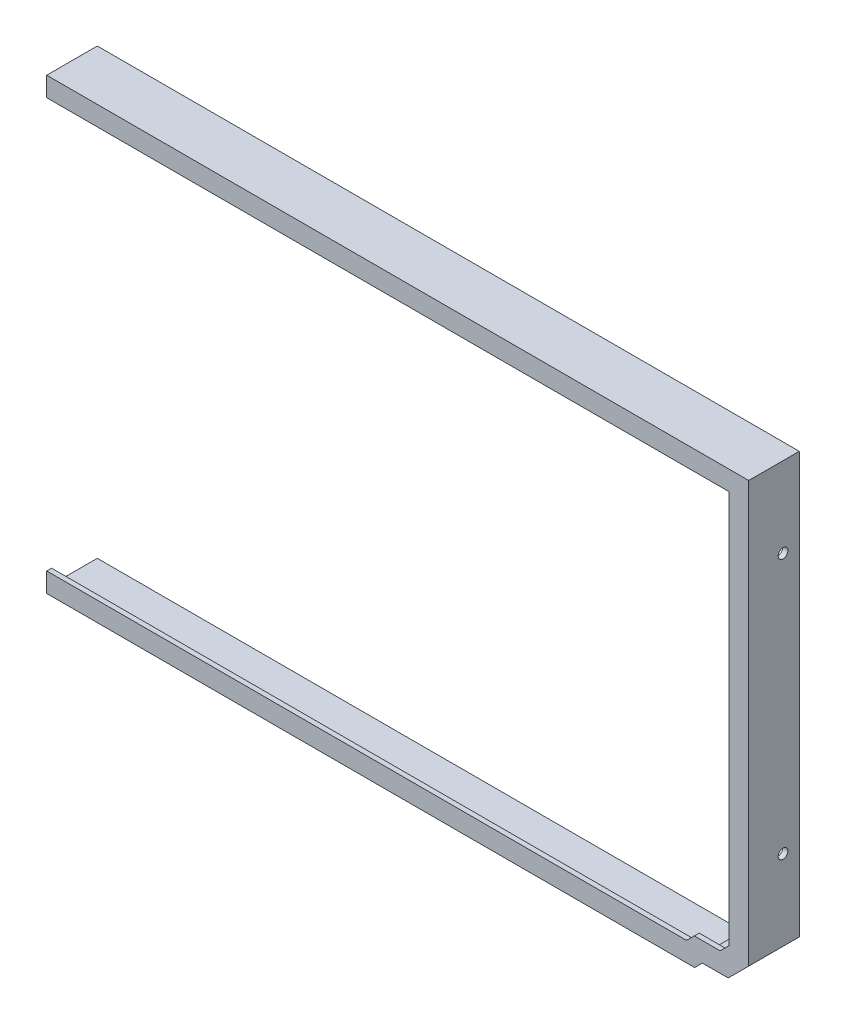
ISO-10303-21;
HEADER;
FILE_DESCRIPTION(('STEP AP214'),'2;1');
FILE_NAME('part.step','',(''),(''),'','','');
FILE_SCHEMA(('AUTOMOTIVE_DESIGN { 1 0 10303 214 1 1 1 1 }'));
ENDSEC;
DATA;
#1=APPLICATION_CONTEXT('core data for automotive mechanical design processes');
#2=APPLICATION_PROTOCOL_DEFINITION('international standard','automotive_design',2000,#1);
#3=PRODUCT_CONTEXT('',#1,'mechanical');
#4=PRODUCT('Part','Part','',(#3));
#5=PRODUCT_RELATED_PRODUCT_CATEGORY('part','',(#4));
#6=PRODUCT_DEFINITION_FORMATION('','',#4);
#7=PRODUCT_DEFINITION_CONTEXT('part definition',#1,'design');
#8=PRODUCT_DEFINITION('design','',#6,#7);
#9=PRODUCT_DEFINITION_SHAPE('','',#8);
#10=(LENGTH_UNIT() NAMED_UNIT(*) SI_UNIT(.MILLI.,.METRE.));
#11=(NAMED_UNIT(*) PLANE_ANGLE_UNIT() SI_UNIT($,.RADIAN.));
#12=(NAMED_UNIT(*) SI_UNIT($,.STERADIAN.) SOLID_ANGLE_UNIT());
#13=UNCERTAINTY_MEASURE_WITH_UNIT(LENGTH_MEASURE(1.E-05),#10,'distance_accuracy_value','');
#14=(GEOMETRIC_REPRESENTATION_CONTEXT(3) GLOBAL_UNCERTAINTY_ASSIGNED_CONTEXT((#13)) GLOBAL_UNIT_ASSIGNED_CONTEXT((#10,
#11,#12)) REPRESENTATION_CONTEXT('',''));
#15=CARTESIAN_POINT('',(0.,0.,0.));
#16=DIRECTION('',(0.,0.,1.));
#17=DIRECTION('',(1.,0.,0.));
#18=AXIS2_PLACEMENT_3D('',#15,#16,#17);
#19=CARTESIAN_POINT('',(-1.7,1.7,-14.05));
#20=DIRECTION('',(0.,1.,0.));
#21=DIRECTION('',(0.,0.,1.));
#22=AXIS2_PLACEMENT_3D('',#19,#20,#21);
#23=PLANE('',#22);
#24=DIRECTION('',(0.,0.,-1.));
#25=VECTOR('',#24,1.);
#26=CARTESIAN_POINT('',(214.14,1.7,1.5));
#27=LINE('',#26,#25);
#28=CARTESIAN_POINT('',(214.14,1.7,1.5));
#29=VERTEX_POINT('',#28);
#30=CARTESIAN_POINT('',(214.14,1.7,-14.05));
#31=VERTEX_POINT('',#30);
#32=EDGE_CURVE('E197',#29,#31,#27,.T.);
#33=ORIENTED_EDGE('',*,*,#32,.F.);
#34=DIRECTION('',(-1.,0.,0.));
#35=VECTOR('',#34,1.);
#36=CARTESIAN_POINT('',(429.98,1.7,1.5));
#37=LINE('',#36,#35);
#38=CARTESIAN_POINT('',(429.98,1.7,1.5));
#39=VERTEX_POINT('',#38);
#40=EDGE_CURVE('E277',#39,#29,#37,.T.);
#41=ORIENTED_EDGE('',*,*,#40,.F.);
#42=DIRECTION('',(0.,0.,1.));
#43=VECTOR('',#42,1.);
#44=CARTESIAN_POINT('',(429.98,1.7,-14.05));
#45=LINE('',#44,#43);
#46=CARTESIAN_POINT('',(429.98,1.7,-14.05));
#47=VERTEX_POINT('',#46);
#48=EDGE_CURVE('E47',#47,#39,#45,.T.);
#49=ORIENTED_EDGE('',*,*,#48,.F.);
#50=DIRECTION('',(-1.,0.,0.));
#51=VECTOR('',#50,1.);
#52=CARTESIAN_POINT('',(-1.7,1.7,-14.05));
#53=LINE('',#52,#51);
#54=EDGE_CURVE('E223',#47,#31,#53,.T.);
#55=ORIENTED_EDGE('',*,*,#54,.T.);
#56=EDGE_LOOP('',(#33,#41,#49,#55));
#57=FACE_BOUND('',#56,.T.);
#58=ADVANCED_FACE('F39',(#57),#23,.T.);
#59=CARTESIAN_POINT('',(429.98,1.7,-14.05));
#60=DIRECTION('',(1.,0.,0.));
#61=DIRECTION('',(0.,0.,-1.));
#62=AXIS2_PLACEMENT_3D('',#59,#60,#61);
#63=PLANE('',#62);
#64=CARTESIAN_POINT('',(429.98,-22.9620815280171,-9.05000000000001));
#65=DIRECTION('',(1.,0.,0.));
#66=DIRECTION('',(0.,0.,-1.));
#67=AXIS2_PLACEMENT_3D('',#64,#65,#66);
#68=CIRCLE('',#67,1.5);
#69=CARTESIAN_POINT('',(429.98,-22.9620815280171,-10.55));
#70=VERTEX_POINT('',#69);
#71=EDGE_CURVE('E238',#70,#70,#68,.F.);
#72=ORIENTED_EDGE('',*,*,#71,.T.);
#73=EDGE_LOOP('',(#72));
#74=FACE_BOUND('',#73,.T.);
#75=CARTESIAN_POINT('',(429.98,-102.962081528017,-9.05000000000001));
#76=DIRECTION('',(1.,0.,0.));
#77=DIRECTION('',(0.,0.,-1.));
#78=AXIS2_PLACEMENT_3D('',#75,#76,#77);
#79=CIRCLE('',#78,1.5);
#80=CARTESIAN_POINT('',(429.98,-102.962081528017,-10.55));
#81=VERTEX_POINT('',#80);
#82=EDGE_CURVE('E359',#81,#81,#79,.F.);
#83=ORIENTED_EDGE('',*,*,#82,.T.);
#84=EDGE_LOOP('',(#83));
#85=FACE_BOUND('',#84,.T.);
#86=ORIENTED_EDGE('',*,*,#48,.T.);
#87=DIRECTION('',(0.,1.,0.));
#88=VECTOR('',#87,1.);
#89=CARTESIAN_POINT('',(429.98,-127.624163056034,1.5));
#90=LINE('',#89,#88);
#91=CARTESIAN_POINT('',(429.98,-127.624163056034,1.5));
#92=VERTEX_POINT('',#91);
#93=EDGE_CURVE('E290',#92,#39,#90,.T.);
#94=ORIENTED_EDGE('',*,*,#93,.F.);
#95=DIRECTION('',(0.,0.,1.));
#96=VECTOR('',#95,1.);
#97=CARTESIAN_POINT('',(429.98,-127.624163056034,-14.05));
#98=LINE('',#97,#96);
#99=CARTESIAN_POINT('',(429.98,-127.624163056034,-14.05));
#100=VERTEX_POINT('',#99);
#101=EDGE_CURVE('E228',#100,#92,#98,.T.);
#102=ORIENTED_EDGE('',*,*,#101,.F.);
#103=DIRECTION('',(0.,1.,0.));
#104=VECTOR('',#103,1.);
#105=CARTESIAN_POINT('',(429.98,1.7,-14.05));
#106=LINE('',#105,#104);
#107=EDGE_CURVE('E220',#100,#47,#106,.T.);
#108=ORIENTED_EDGE('',*,*,#107,.T.);
#109=EDGE_LOOP('',(#86,#94,#102,#108));
#110=FACE_BOUND('',#109,.T.);
#111=ADVANCED_FACE('F407',(#74,#85,#110),#63,.T.);
#112=CARTESIAN_POINT('',(429.98,-127.624163056034,-14.05));
#113=DIRECTION('',(0.707106781186549,-0.707106781186546,0.));
#114=DIRECTION('',(0.707106781186546,0.707106781186549,0.));
#115=AXIS2_PLACEMENT_3D('',#112,#113,#114);
#116=PLANE('',#115);
#117=ORIENTED_EDGE('',*,*,#101,.T.);
#118=DIRECTION('',(0.707106781186546,0.707106781186549,0.));
#119=VECTOR('',#118,1.);
#120=CARTESIAN_POINT('',(423.673791129323,-133.930371926711,1.5));
#121=LINE('',#120,#119);
#122=CARTESIAN_POINT('',(423.673791129323,-133.930371926711,1.5));
#123=VERTEX_POINT('',#122);
#124=EDGE_CURVE('E287',#123,#92,#121,.T.);
#125=ORIENTED_EDGE('',*,*,#124,.F.);
#126=DIRECTION('',(0.,0.,1.));
#127=VECTOR('',#126,1.);
#128=CARTESIAN_POINT('',(423.673791129323,-133.930371926711,-14.05));
#129=LINE('',#128,#127);
#130=CARTESIAN_POINT('',(423.673791129323,-133.930371926711,-14.05));
#131=VERTEX_POINT('',#130);
#132=EDGE_CURVE('E230',#131,#123,#129,.T.);
#133=ORIENTED_EDGE('',*,*,#132,.F.);
#134=DIRECTION('',(0.707106781186546,0.707106781186549,0.));
#135=VECTOR('',#134,1.);
#136=CARTESIAN_POINT('',(429.98,-127.624163056034,-14.05));
#137=LINE('',#136,#135);
#138=EDGE_CURVE('E217',#131,#100,#137,.T.);
#139=ORIENTED_EDGE('',*,*,#138,.T.);
#140=EDGE_LOOP('',(#117,#125,#133,#139));
#141=FACE_BOUND('',#140,.T.);
#142=ADVANCED_FACE('F415',(#141),#116,.T.);
#143=CARTESIAN_POINT('',(423.673791129323,-133.930371926711,-14.05));
#144=DIRECTION('',(0.,-1.,0.));
#145=DIRECTION('',(0.,0.,-1.));
#146=AXIS2_PLACEMENT_3D('',#143,#144,#145);
#147=PLANE('',#146);
#148=ORIENTED_EDGE('',*,*,#132,.T.);
#149=DIRECTION('',(1.,0.,0.));
#150=VECTOR('',#149,1.);
#151=CARTESIAN_POINT('',(415.733791129323,-133.930371926711,1.5));
#152=LINE('',#151,#150);
#153=CARTESIAN_POINT('',(415.733791129323,-133.930371926711,1.5));
#154=VERTEX_POINT('',#153);
#155=EDGE_CURVE('E284',#154,#123,#152,.T.);
#156=ORIENTED_EDGE('',*,*,#155,.F.);
#157=DIRECTION('',(0.,0.,1.));
#158=VECTOR('',#157,1.);
#159=CARTESIAN_POINT('',(415.733791129323,-133.930371926711,-14.05));
#160=LINE('',#159,#158);
#161=CARTESIAN_POINT('',(415.733791129323,-133.930371926711,-14.05));
#162=VERTEX_POINT('',#161);
#163=EDGE_CURVE('E232',#162,#154,#160,.T.);
#164=ORIENTED_EDGE('',*,*,#163,.F.);
#165=DIRECTION('',(1.,0.,0.));
#166=VECTOR('',#165,1.);
#167=CARTESIAN_POINT('',(423.673791129323,-133.930371926711,-14.05));
#168=LINE('',#167,#166);
#169=EDGE_CURVE('E206',#162,#131,#168,.T.);
#170=ORIENTED_EDGE('',*,*,#169,.T.);
#171=EDGE_LOOP('',(#148,#156,#164,#170));
#172=FACE_BOUND('',#171,.T.);
#173=ADVANCED_FACE('F423',(#172),#147,.T.);
#174=CARTESIAN_POINT('',(415.733791129323,-133.930371926711,-14.05));
#175=DIRECTION('',(0.707106781186543,-0.707106781186552,0.));
#176=DIRECTION('',(0.707106781186552,0.707106781186543,0.));
#177=AXIS2_PLACEMENT_3D('',#174,#175,#176);
#178=PLANE('',#177);
#179=ORIENTED_EDGE('',*,*,#163,.T.);
#180=DIRECTION('',(0.707106781186552,0.707106781186543,0.));
#181=VECTOR('',#180,1.);
#182=CARTESIAN_POINT('',(413.350841276725,-136.31332177931,1.5));
#183=LINE('',#182,#181);
#184=CARTESIAN_POINT('',(413.350841276725,-136.31332177931,1.5));
#185=VERTEX_POINT('',#184);
#186=EDGE_CURVE('E281',#185,#154,#183,.T.);
#187=ORIENTED_EDGE('',*,*,#186,.F.);
#188=DIRECTION('',(0.,0.,1.));
#189=VECTOR('',#188,1.);
#190=CARTESIAN_POINT('',(413.350841276725,-136.31332177931,-14.05));
#191=LINE('',#190,#189);
#192=CARTESIAN_POINT('',(413.350841276725,-136.31332177931,-14.05));
#193=VERTEX_POINT('',#192);
#194=EDGE_CURVE('E226',#193,#185,#191,.T.);
#195=ORIENTED_EDGE('',*,*,#194,.F.);
#196=DIRECTION('',(0.707106781186552,0.707106781186543,0.));
#197=VECTOR('',#196,1.);
#198=CARTESIAN_POINT('',(415.733791129323,-133.930371926711,-14.05));
#199=LINE('',#198,#197);
#200=EDGE_CURVE('E203',#193,#162,#199,.T.);
#201=ORIENTED_EDGE('',*,*,#200,.T.);
#202=EDGE_LOOP('',(#179,#187,#195,#201));
#203=FACE_BOUND('',#202,.T.);
#204=ADVANCED_FACE('F426',(#203),#178,.T.);
#205=CARTESIAN_POINT('',(413.350841276725,-136.31332177931,-14.05));
#206=DIRECTION('',(0.,-1.,0.));
#207=DIRECTION('',(0.,0.,-1.));
#208=AXIS2_PLACEMENT_3D('',#205,#206,#207);
#209=PLANE('',#208);
#210=DIRECTION('',(0.,0.,-1.));
#211=VECTOR('',#210,1.);
#212=CARTESIAN_POINT('',(214.14,-136.31332177931,1.5));
#213=LINE('',#212,#211);
#214=CARTESIAN_POINT('',(214.14,-136.31332177931,1.5));
#215=VERTEX_POINT('',#214);
#216=CARTESIAN_POINT('',(214.14,-136.31332177931,-14.05));
#217=VERTEX_POINT('',#216);
#218=EDGE_CURVE('E182',#215,#217,#213,.T.);
#219=ORIENTED_EDGE('',*,*,#218,.T.);
#220=DIRECTION('',(1.,0.,0.));
#221=VECTOR('',#220,1.);
#222=CARTESIAN_POINT('',(413.350841276725,-136.31332177931,-14.05));
#223=LINE('',#222,#221);
#224=EDGE_CURVE('E194',#217,#193,#223,.T.);
#225=ORIENTED_EDGE('',*,*,#224,.T.);
#226=ORIENTED_EDGE('',*,*,#194,.T.);
#227=DIRECTION('',(1.,0.,0.));
#228=VECTOR('',#227,1.);
#229=CARTESIAN_POINT('',(14.9291587232754,-136.31332177931,1.5));
#230=LINE('',#229,#228);
#231=EDGE_CURVE('E196',#215,#185,#230,.T.);
#232=ORIENTED_EDGE('',*,*,#231,.F.);
#233=EDGE_LOOP('',(#219,#225,#226,#232));
#234=FACE_BOUND('',#233,.T.);
#235=ADVANCED_FACE('F41',(#234),#209,.T.);
#236=CARTESIAN_POINT('',(0.,0.,-14.05));
#237=DIRECTION('',(0.,0.,1.));
#238=DIRECTION('',(1.,0.,0.));
#239=AXIS2_PLACEMENT_3D('',#236,#237,#238);
#240=PLANE('',#239);
#241=ORIENTED_EDGE('',*,*,#224,.F.);
#242=DIRECTION('',(0.,1.,0.));
#243=VECTOR('',#242,1.);
#244=CARTESIAN_POINT('',(214.14,-136.31332177931,-14.05));
#245=LINE('',#244,#243);
#246=CARTESIAN_POINT('',(214.14,-134.71332177931,-14.05));
#247=VERTEX_POINT('',#246);
#248=EDGE_CURVE('E179',#217,#247,#245,.T.);
#249=ORIENTED_EDGE('',*,*,#248,.T.);
#250=DIRECTION('',(1.,0.,0.));
#251=VECTOR('',#250,1.);
#252=CARTESIAN_POINT('',(412.688099576928,-134.71332177931,-14.05));
#253=LINE('',#252,#251);
#254=CARTESIAN_POINT('',(412.688099576928,-134.71332177931,-14.05));
#255=VERTEX_POINT('',#254);
#256=EDGE_CURVE('E294',#247,#255,#253,.T.);
#257=ORIENTED_EDGE('',*,*,#256,.T.);
#258=DIRECTION('',(0.707106781186552,0.707106781186543,0.));
#259=VECTOR('',#258,1.);
#260=CARTESIAN_POINT('',(415.071049429526,-132.330371926711,-14.05));
#261=LINE('',#260,#259);
#262=CARTESIAN_POINT('',(415.071049429526,-132.330371926711,-14.05));
#263=VERTEX_POINT('',#262);
#264=EDGE_CURVE('E296',#255,#263,#261,.T.);
#265=ORIENTED_EDGE('',*,*,#264,.T.);
#266=DIRECTION('',(1.,0.,0.));
#267=VECTOR('',#266,1.);
#268=CARTESIAN_POINT('',(423.011049429526,-132.330371926711,-14.05));
#269=LINE('',#268,#267);
#270=CARTESIAN_POINT('',(423.011049429526,-132.330371926711,-14.05));
#271=VERTEX_POINT('',#270);
#272=EDGE_CURVE('E300',#263,#271,#269,.T.);
#273=ORIENTED_EDGE('',*,*,#272,.T.);
#274=DIRECTION('',(0.707106781186547,0.707106781186547,0.));
#275=VECTOR('',#274,1.);
#276=CARTESIAN_POINT('',(428.38,-126.961421356237,-14.05));
#277=LINE('',#276,#275);
#278=CARTESIAN_POINT('',(428.38,-126.961421356237,-14.05));
#279=VERTEX_POINT('',#278);
#280=EDGE_CURVE('E303',#271,#279,#277,.T.);
#281=ORIENTED_EDGE('',*,*,#280,.T.);
#282=DIRECTION('',(0.,1.,0.));
#283=VECTOR('',#282,1.);
#284=CARTESIAN_POINT('',(428.38,0.1,-14.05));
#285=LINE('',#284,#283);
#286=CARTESIAN_POINT('',(428.38,0.1,-14.05));
#287=VERTEX_POINT('',#286);
#288=EDGE_CURVE('E306',#279,#287,#285,.T.);
#289=ORIENTED_EDGE('',*,*,#288,.T.);
#290=DIRECTION('',(-1.,0.,0.));
#291=VECTOR('',#290,1.);
#292=CARTESIAN_POINT('',(-0.1,0.1,-14.05));
#293=LINE('',#292,#291);
#294=CARTESIAN_POINT('',(214.14,0.099999999999989,-14.05));
#295=VERTEX_POINT('',#294);
#296=EDGE_CURVE('E309',#287,#295,#293,.T.);
#297=ORIENTED_EDGE('',*,*,#296,.T.);
#298=EDGE_CURVE('E189',#295,#31,#245,.T.);
#299=ORIENTED_EDGE('',*,*,#298,.T.);
#300=ORIENTED_EDGE('',*,*,#54,.F.);
#301=ORIENTED_EDGE('',*,*,#107,.F.);
#302=ORIENTED_EDGE('',*,*,#138,.F.);
#303=ORIENTED_EDGE('',*,*,#169,.F.);
#304=ORIENTED_EDGE('',*,*,#200,.F.);
#305=EDGE_LOOP('',(#241,#249,#257,#265,#273,#281,#289,#297,#299,#300,#301,#302,#303,#304));
#306=FACE_BOUND('',#305,.T.);
#307=ADVANCED_FACE('F200',(#306),#240,.F.);
#308=CARTESIAN_POINT('',(-0.1,0.1,-14.05));
#309=DIRECTION('',(0.,1.,0.));
#310=DIRECTION('',(0.,0.,1.));
#311=AXIS2_PLACEMENT_3D('',#308,#309,#310);
#312=PLANE('',#311);
#313=DIRECTION('',(-1.,0.,0.));
#314=VECTOR('',#313,1.);
#315=CARTESIAN_POINT('',(-0.1,0.1,0.));
#316=LINE('',#315,#314);
#317=CARTESIAN_POINT('',(428.38,0.1,0.));
#318=VERTEX_POINT('',#317);
#319=CARTESIAN_POINT('',(214.14,0.1,0.));
#320=VERTEX_POINT('',#319);
#321=EDGE_CURVE('E297',#318,#320,#316,.T.);
#322=ORIENTED_EDGE('',*,*,#321,.T.);
#323=DIRECTION('',(0.,0.,-1.));
#324=VECTOR('',#323,1.);
#325=CARTESIAN_POINT('',(214.14,0.1,-14.05));
#326=LINE('',#325,#324);
#327=EDGE_CURVE('E358',#320,#295,#326,.T.);
#328=ORIENTED_EDGE('',*,*,#327,.T.);
#329=ORIENTED_EDGE('',*,*,#296,.F.);
#330=DIRECTION('',(0.,0.,1.));
#331=VECTOR('',#330,1.);
#332=CARTESIAN_POINT('',(428.38,0.1,-14.05));
#333=LINE('',#332,#331);
#334=EDGE_CURVE('E204',#287,#318,#333,.T.);
#335=ORIENTED_EDGE('',*,*,#334,.T.);
#336=EDGE_LOOP('',(#322,#328,#329,#335));
#337=FACE_BOUND('',#336,.T.);
#338=ADVANCED_FACE('F357',(#337),#312,.F.);
#339=CARTESIAN_POINT('',(428.38,0.1,-14.05));
#340=DIRECTION('',(1.,0.,0.));
#341=DIRECTION('',(0.,0.,-1.));
#342=AXIS2_PLACEMENT_3D('',#339,#340,#341);
#343=PLANE('',#342);
#344=CARTESIAN_POINT('',(428.38,-22.9620815280171,-9.05000000000001));
#345=DIRECTION('',(1.,0.,0.));
#346=DIRECTION('',(0.,0.,-1.));
#347=AXIS2_PLACEMENT_3D('',#344,#345,#346);
#348=CIRCLE('',#347,1.5);
#349=CARTESIAN_POINT('',(428.38,-22.9620815280171,-10.55));
#350=VERTEX_POINT('',#349);
#351=EDGE_CURVE('E237',#350,#350,#348,.T.);
#352=ORIENTED_EDGE('',*,*,#351,.T.);
#353=EDGE_LOOP('',(#352));
#354=FACE_BOUND('',#353,.T.);
#355=CARTESIAN_POINT('',(428.38,-102.962081528017,-9.05000000000001));
#356=DIRECTION('',(1.,0.,0.));
#357=DIRECTION('',(0.,0.,-1.));
#358=AXIS2_PLACEMENT_3D('',#355,#356,#357);
#359=CIRCLE('',#358,1.5);
#360=CARTESIAN_POINT('',(428.38,-102.962081528017,-10.55));
#361=VERTEX_POINT('',#360);
#362=EDGE_CURVE('E235',#361,#361,#359,.T.);
#363=ORIENTED_EDGE('',*,*,#362,.T.);
#364=EDGE_LOOP('',(#363));
#365=FACE_BOUND('',#364,.T.);
#366=DIRECTION('',(0.,1.,0.));
#367=VECTOR('',#366,1.);
#368=CARTESIAN_POINT('',(428.38,0.1,0.));
#369=LINE('',#368,#367);
#370=CARTESIAN_POINT('',(428.38,-126.961421356237,0.));
#371=VERTEX_POINT('',#370);
#372=EDGE_CURVE('E322',#371,#318,#369,.T.);
#373=ORIENTED_EDGE('',*,*,#372,.T.);
#374=ORIENTED_EDGE('',*,*,#334,.F.);
#375=ORIENTED_EDGE('',*,*,#288,.F.);
#376=DIRECTION('',(0.,0.,1.));
#377=VECTOR('',#376,1.);
#378=CARTESIAN_POINT('',(428.38,-126.961421356237,-14.05));
#379=LINE('',#378,#377);
#380=EDGE_CURVE('E209',#279,#371,#379,.T.);
#381=ORIENTED_EDGE('',*,*,#380,.T.);
#382=EDGE_LOOP('',(#373,#374,#375,#381));
#383=FACE_BOUND('',#382,.T.);
#384=ADVANCED_FACE('F354',(#354,#365,#383),#343,.F.);
#385=CARTESIAN_POINT('',(428.38,-126.961421356237,-14.05));
#386=DIRECTION('',(0.707106781186547,-0.707106781186547,0.));
#387=DIRECTION('',(0.707106781186548,0.707106781186548,0.));
#388=AXIS2_PLACEMENT_3D('',#385,#386,#387);
#389=PLANE('',#388);
#390=DIRECTION('',(0.707106781186547,0.707106781186547,0.));
#391=VECTOR('',#390,1.);
#392=CARTESIAN_POINT('',(428.38,-126.961421356237,0.));
#393=LINE('',#392,#391);
#394=CARTESIAN_POINT('',(423.011049429526,-132.330371926711,0.));
#395=VERTEX_POINT('',#394);
#396=EDGE_CURVE('E319',#395,#371,#393,.T.);
#397=ORIENTED_EDGE('',*,*,#396,.T.);
#398=ORIENTED_EDGE('',*,*,#380,.F.);
#399=ORIENTED_EDGE('',*,*,#280,.F.);
#400=DIRECTION('',(0.,0.,1.));
#401=VECTOR('',#400,1.);
#402=CARTESIAN_POINT('',(423.011049429526,-132.330371926711,-14.05));
#403=LINE('',#402,#401);
#404=EDGE_CURVE('E329',#271,#395,#403,.T.);
#405=ORIENTED_EDGE('',*,*,#404,.T.);
#406=EDGE_LOOP('',(#397,#398,#399,#405));
#407=FACE_BOUND('',#406,.T.);
#408=ADVANCED_FACE('F349',(#407),#389,.F.);
#409=CARTESIAN_POINT('',(423.011049429526,-132.330371926711,-14.05));
#410=DIRECTION('',(0.,-1.,0.));
#411=DIRECTION('',(0.,0.,-1.));
#412=AXIS2_PLACEMENT_3D('',#409,#410,#411);
#413=PLANE('',#412);
#414=DIRECTION('',(1.,0.,0.));
#415=VECTOR('',#414,1.);
#416=CARTESIAN_POINT('',(423.011049429526,-132.330371926711,0.));
#417=LINE('',#416,#415);
#418=CARTESIAN_POINT('',(415.071049429526,-132.330371926711,0.));
#419=VERTEX_POINT('',#418);
#420=EDGE_CURVE('E316',#419,#395,#417,.T.);
#421=ORIENTED_EDGE('',*,*,#420,.T.);
#422=ORIENTED_EDGE('',*,*,#404,.F.);
#423=ORIENTED_EDGE('',*,*,#272,.F.);
#424=DIRECTION('',(0.,0.,1.));
#425=VECTOR('',#424,1.);
#426=CARTESIAN_POINT('',(415.071049429526,-132.330371926711,-14.05));
#427=LINE('',#426,#425);
#428=EDGE_CURVE('E331',#263,#419,#427,.T.);
#429=ORIENTED_EDGE('',*,*,#428,.T.);
#430=EDGE_LOOP('',(#421,#422,#423,#429));
#431=FACE_BOUND('',#430,.T.);
#432=ADVANCED_FACE('F346',(#431),#413,.F.);
#433=CARTESIAN_POINT('',(415.071049429526,-132.330371926711,-14.05));
#434=DIRECTION('',(0.707106781186543,-0.707106781186552,0.));
#435=DIRECTION('',(0.707106781186552,0.707106781186543,0.));
#436=AXIS2_PLACEMENT_3D('',#433,#434,#435);
#437=PLANE('',#436);
#438=DIRECTION('',(0.707106781186552,0.707106781186543,0.));
#439=VECTOR('',#438,1.);
#440=CARTESIAN_POINT('',(415.071049429526,-132.330371926711,0.));
#441=LINE('',#440,#439);
#442=CARTESIAN_POINT('',(412.688099576928,-134.71332177931,0.));
#443=VERTEX_POINT('',#442);
#444=EDGE_CURVE('E313',#443,#419,#441,.T.);
#445=ORIENTED_EDGE('',*,*,#444,.T.);
#446=ORIENTED_EDGE('',*,*,#428,.F.);
#447=ORIENTED_EDGE('',*,*,#264,.F.);
#448=DIRECTION('',(0.,0.,1.));
#449=VECTOR('',#448,1.);
#450=CARTESIAN_POINT('',(412.688099576928,-134.71332177931,-14.05));
#451=LINE('',#450,#449);
#452=EDGE_CURVE('E212',#255,#443,#451,.T.);
#453=ORIENTED_EDGE('',*,*,#452,.T.);
#454=EDGE_LOOP('',(#445,#446,#447,#453));
#455=FACE_BOUND('',#454,.T.);
#456=ADVANCED_FACE('F339',(#455),#437,.F.);
#457=CARTESIAN_POINT('',(412.688099576928,-134.71332177931,-14.05));
#458=DIRECTION('',(0.,-1.,0.));
#459=DIRECTION('',(0.,0.,-1.));
#460=AXIS2_PLACEMENT_3D('',#457,#458,#459);
#461=PLANE('',#460);
#462=ORIENTED_EDGE('',*,*,#256,.F.);
#463=DIRECTION('',(0.,0.,1.));
#464=VECTOR('',#463,1.);
#465=CARTESIAN_POINT('',(214.14,-134.71332177931,-14.05));
#466=LINE('',#465,#464);
#467=CARTESIAN_POINT('',(214.14,-134.71332177931,0.));
#468=VERTEX_POINT('',#467);
#469=EDGE_CURVE('E184',#247,#468,#466,.T.);
#470=ORIENTED_EDGE('',*,*,#469,.T.);
#471=DIRECTION('',(1.,0.,0.));
#472=VECTOR('',#471,1.);
#473=CARTESIAN_POINT('',(412.688099576928,-134.71332177931,0.));
#474=LINE('',#473,#472);
#475=EDGE_CURVE('E293',#468,#443,#474,.T.);
#476=ORIENTED_EDGE('',*,*,#475,.T.);
#477=ORIENTED_EDGE('',*,*,#452,.F.);
#478=EDGE_LOOP('',(#462,#470,#476,#477));
#479=FACE_BOUND('',#478,.T.);
#480=ADVANCED_FACE('F342',(#479),#461,.F.);
#481=CARTESIAN_POINT('',(0.,0.,1.5));
#482=DIRECTION('',(0.,0.,1.));
#483=DIRECTION('',(1.,0.,0.));
#484=AXIS2_PLACEMENT_3D('',#481,#482,#483);
#485=PLANE('',#484);
#486=DIRECTION('',(0.,1.,0.));
#487=VECTOR('',#486,1.);
#488=CARTESIAN_POINT('',(214.14,-136.31332177931,1.5));
#489=LINE('',#488,#487);
#490=CARTESIAN_POINT('',(214.14,-130.31332177931,1.5));
#491=VERTEX_POINT('',#490);
#492=EDGE_CURVE('E61',#215,#491,#489,.T.);
#493=ORIENTED_EDGE('',*,*,#492,.F.);
#494=ORIENTED_EDGE('',*,*,#231,.T.);
#495=ORIENTED_EDGE('',*,*,#186,.T.);
#496=ORIENTED_EDGE('',*,*,#155,.T.);
#497=ORIENTED_EDGE('',*,*,#124,.T.);
#498=ORIENTED_EDGE('',*,*,#93,.T.);
#499=ORIENTED_EDGE('',*,*,#40,.T.);
#500=CARTESIAN_POINT('',(214.14,-4.3,1.5));
#501=VERTEX_POINT('',#500);
#502=EDGE_CURVE('E188',#501,#29,#489,.T.);
#503=ORIENTED_EDGE('',*,*,#502,.F.);
#504=DIRECTION('',(-1.,0.,0.));
#505=VECTOR('',#504,1.);
#506=CARTESIAN_POINT('',(423.98,-4.3,1.5));
#507=LINE('',#506,#505);
#508=CARTESIAN_POINT('',(423.98,-4.3,1.5));
#509=VERTEX_POINT('',#508);
#510=EDGE_CURVE('E264',#509,#501,#507,.T.);
#511=ORIENTED_EDGE('',*,*,#510,.F.);
#512=DIRECTION('',(0.,1.,0.));
#513=VECTOR('',#512,1.);
#514=CARTESIAN_POINT('',(423.98,-125.138881681796,1.5));
#515=LINE('',#514,#513);
#516=CARTESIAN_POINT('',(423.98,-125.138881681796,1.5));
#517=VERTEX_POINT('',#516);
#518=EDGE_CURVE('E251',#517,#509,#515,.T.);
#519=ORIENTED_EDGE('',*,*,#518,.F.);
#520=DIRECTION('',(0.707106781186544,0.707106781186551,0.));
#521=VECTOR('',#520,1.);
#522=CARTESIAN_POINT('',(421.188509755085,-127.930371926711,1.5));
#523=LINE('',#522,#521);
#524=CARTESIAN_POINT('',(421.188509755085,-127.930371926711,1.5));
#525=VERTEX_POINT('',#524);
#526=EDGE_CURVE('E378',#525,#517,#523,.T.);
#527=ORIENTED_EDGE('',*,*,#526,.F.);
#528=DIRECTION('',(1.,0.,0.));
#529=VECTOR('',#528,1.);
#530=CARTESIAN_POINT('',(413.248509755085,-127.930371926711,1.5));
#531=LINE('',#530,#529);
#532=CARTESIAN_POINT('',(413.248509755085,-127.930371926711,1.5));
#533=VERTEX_POINT('',#532);
#534=EDGE_CURVE('E377',#533,#525,#531,.T.);
#535=ORIENTED_EDGE('',*,*,#534,.F.);
#536=DIRECTION('',(0.707106781186552,0.707106781186543,0.));
#537=VECTOR('',#536,1.);
#538=CARTESIAN_POINT('',(410.865559902486,-130.31332177931,1.5));
#539=LINE('',#538,#537);
#540=CARTESIAN_POINT('',(410.865559902486,-130.31332177931,1.5));
#541=VERTEX_POINT('',#540);
#542=EDGE_CURVE('E375',#541,#533,#539,.T.);
#543=ORIENTED_EDGE('',*,*,#542,.F.);
#544=DIRECTION('',(1.,0.,0.));
#545=VECTOR('',#544,1.);
#546=CARTESIAN_POINT('',(17.414440097514,-130.31332177931,1.5));
#547=LINE('',#546,#545);
#548=EDGE_CURVE('E373',#491,#541,#547,.T.);
#549=ORIENTED_EDGE('',*,*,#548,.F.);
#550=EDGE_LOOP('',(#493,#494,#495,#496,#497,#498,#499,#503,#511,#519,#527,#535,#543,#549));
#551=FACE_BOUND('',#550,.T.);
#552=ADVANCED_FACE('F393',(#551),#485,.T.);
#553=CARTESIAN_POINT('',(0.,0.,0.));
#554=DIRECTION('',(0.,0.,1.));
#555=DIRECTION('',(1.,0.,0.));
#556=AXIS2_PLACEMENT_3D('',#553,#554,#555);
#557=PLANE('',#556);
#558=ORIENTED_EDGE('',*,*,#475,.F.);
#559=DIRECTION('',(0.,1.,0.));
#560=VECTOR('',#559,1.);
#561=CARTESIAN_POINT('',(214.14,0.,0.));
#562=LINE('',#561,#560);
#563=CARTESIAN_POINT('',(214.14,-130.31332177931,0.));
#564=VERTEX_POINT('',#563);
#565=EDGE_CURVE('E365',#468,#564,#562,.T.);
#566=ORIENTED_EDGE('',*,*,#565,.T.);
#567=DIRECTION('',(1.,0.,0.));
#568=VECTOR('',#567,1.);
#569=CARTESIAN_POINT('',(17.414440097514,-130.31332177931,0.));
#570=LINE('',#569,#568);
#571=CARTESIAN_POINT('',(410.865559902486,-130.31332177931,0.));
#572=VERTEX_POINT('',#571);
#573=EDGE_CURVE('E244',#564,#572,#570,.T.);
#574=ORIENTED_EDGE('',*,*,#573,.T.);
#575=DIRECTION('',(0.707106781186552,0.707106781186543,0.));
#576=VECTOR('',#575,1.);
#577=CARTESIAN_POINT('',(410.865559902486,-130.31332177931,0.));
#578=LINE('',#577,#576);
#579=CARTESIAN_POINT('',(413.248509755085,-127.930371926711,0.));
#580=VERTEX_POINT('',#579);
#581=EDGE_CURVE('E248',#572,#580,#578,.T.);
#582=ORIENTED_EDGE('',*,*,#581,.T.);
#583=DIRECTION('',(1.,0.,0.));
#584=VECTOR('',#583,1.);
#585=CARTESIAN_POINT('',(413.248509755085,-127.930371926711,0.));
#586=LINE('',#585,#584);
#587=CARTESIAN_POINT('',(421.188509755085,-127.930371926711,0.));
#588=VERTEX_POINT('',#587);
#589=EDGE_CURVE('E256',#580,#588,#586,.T.);
#590=ORIENTED_EDGE('',*,*,#589,.T.);
#591=DIRECTION('',(0.707106781186544,0.707106781186551,0.));
#592=VECTOR('',#591,1.);
#593=CARTESIAN_POINT('',(421.188509755085,-127.930371926711,0.));
#594=LINE('',#593,#592);
#595=CARTESIAN_POINT('',(423.98,-125.138881681796,0.));
#596=VERTEX_POINT('',#595);
#597=EDGE_CURVE('E259',#588,#596,#594,.T.);
#598=ORIENTED_EDGE('',*,*,#597,.T.);
#599=DIRECTION('',(0.,1.,0.));
#600=VECTOR('',#599,1.);
#601=CARTESIAN_POINT('',(423.98,-125.138881681796,0.));
#602=LINE('',#601,#600);
#603=CARTESIAN_POINT('',(423.98,-4.3,0.));
#604=VERTEX_POINT('',#603);
#605=EDGE_CURVE('E262',#596,#604,#602,.T.);
#606=ORIENTED_EDGE('',*,*,#605,.T.);
#607=DIRECTION('',(-1.,0.,0.));
#608=VECTOR('',#607,1.);
#609=CARTESIAN_POINT('',(423.98,-4.3,0.));
#610=LINE('',#609,#608);
#611=CARTESIAN_POINT('',(214.14,-4.3,0.));
#612=VERTEX_POINT('',#611);
#613=EDGE_CURVE('E240',#604,#612,#610,.T.);
#614=ORIENTED_EDGE('',*,*,#613,.T.);
#615=EDGE_CURVE('E54',#612,#320,#562,.T.);
#616=ORIENTED_EDGE('',*,*,#615,.T.);
#617=ORIENTED_EDGE('',*,*,#321,.F.);
#618=ORIENTED_EDGE('',*,*,#372,.F.);
#619=ORIENTED_EDGE('',*,*,#396,.F.);
#620=ORIENTED_EDGE('',*,*,#420,.F.);
#621=ORIENTED_EDGE('',*,*,#444,.F.);
#622=EDGE_LOOP('',(#558,#566,#574,#582,#590,#598,#606,#614,#616,#617,#618,#619,#620,#621));
#623=FACE_BOUND('',#622,.T.);
#624=ADVANCED_FACE('F345',(#623),#557,.F.);
#625=CARTESIAN_POINT('',(423.98,-4.3,1.5));
#626=DIRECTION('',(0.,-1.,0.));
#627=DIRECTION('',(0.,0.,-1.));
#628=AXIS2_PLACEMENT_3D('',#625,#626,#627);
#629=PLANE('',#628);
#630=DIRECTION('',(0.,0.,1.));
#631=VECTOR('',#630,1.);
#632=CARTESIAN_POINT('',(214.14,-4.3,1.5));
#633=LINE('',#632,#631);
#634=EDGE_CURVE('E363',#612,#501,#633,.T.);
#635=ORIENTED_EDGE('',*,*,#634,.F.);
#636=ORIENTED_EDGE('',*,*,#613,.F.);
#637=DIRECTION('',(0.,0.,-1.));
#638=VECTOR('',#637,1.);
#639=CARTESIAN_POINT('',(423.98,-4.3,1.5));
#640=LINE('',#639,#638);
#641=EDGE_CURVE('E265',#509,#604,#640,.T.);
#642=ORIENTED_EDGE('',*,*,#641,.F.);
#643=ORIENTED_EDGE('',*,*,#510,.T.);
#644=EDGE_LOOP('',(#635,#636,#642,#643));
#645=FACE_BOUND('',#644,.T.);
#646=ADVANCED_FACE('F391',(#645),#629,.T.);
#647=CARTESIAN_POINT('',(17.414440097514,-130.31332177931,1.5));
#648=DIRECTION('',(0.,1.,0.));
#649=DIRECTION('',(0.,0.,1.));
#650=AXIS2_PLACEMENT_3D('',#647,#648,#649);
#651=PLANE('',#650);
#652=DIRECTION('',(0.,0.,-1.));
#653=VECTOR('',#652,1.);
#654=CARTESIAN_POINT('',(214.14,-130.31332177931,1.5));
#655=LINE('',#654,#653);
#656=EDGE_CURVE('E11',#491,#564,#655,.T.);
#657=ORIENTED_EDGE('',*,*,#656,.F.);
#658=ORIENTED_EDGE('',*,*,#548,.T.);
#659=DIRECTION('',(0.,0.,-1.));
#660=VECTOR('',#659,1.);
#661=CARTESIAN_POINT('',(410.865559902486,-130.31332177931,1.5));
#662=LINE('',#661,#660);
#663=EDGE_CURVE('E274',#541,#572,#662,.T.);
#664=ORIENTED_EDGE('',*,*,#663,.T.);
#665=ORIENTED_EDGE('',*,*,#573,.F.);
#666=EDGE_LOOP('',(#657,#658,#664,#665));
#667=FACE_BOUND('',#666,.T.);
#668=ADVANCED_FACE('F446',(#667),#651,.T.);
#669=CARTESIAN_POINT('',(410.865559902486,-130.31332177931,1.5));
#670=DIRECTION('',(-0.707106781186543,0.707106781186552,0.));
#671=DIRECTION('',(-0.707106781186552,-0.707106781186543,0.));
#672=AXIS2_PLACEMENT_3D('',#669,#670,#671);
#673=PLANE('',#672);
#674=ORIENTED_EDGE('',*,*,#581,.F.);
#675=ORIENTED_EDGE('',*,*,#663,.F.);
#676=ORIENTED_EDGE('',*,*,#542,.T.);
#677=DIRECTION('',(0.,0.,-1.));
#678=VECTOR('',#677,1.);
#679=CARTESIAN_POINT('',(413.248509755085,-127.930371926711,1.5));
#680=LINE('',#679,#678);
#681=EDGE_CURVE('E272',#533,#580,#680,.T.);
#682=ORIENTED_EDGE('',*,*,#681,.T.);
#683=EDGE_LOOP('',(#674,#675,#676,#682));
#684=FACE_BOUND('',#683,.T.);
#685=ADVANCED_FACE('F450',(#684),#673,.T.);
#686=CARTESIAN_POINT('',(413.248509755085,-127.930371926711,1.5));
#687=DIRECTION('',(0.,1.,0.));
#688=DIRECTION('',(0.,0.,1.));
#689=AXIS2_PLACEMENT_3D('',#686,#687,#688);
#690=PLANE('',#689);
#691=ORIENTED_EDGE('',*,*,#589,.F.);
#692=ORIENTED_EDGE('',*,*,#681,.F.);
#693=ORIENTED_EDGE('',*,*,#534,.T.);
#694=DIRECTION('',(0.,0.,-1.));
#695=VECTOR('',#694,1.);
#696=CARTESIAN_POINT('',(421.188509755085,-127.930371926711,1.5));
#697=LINE('',#696,#695);
#698=EDGE_CURVE('E270',#525,#588,#697,.T.);
#699=ORIENTED_EDGE('',*,*,#698,.T.);
#700=EDGE_LOOP('',(#691,#692,#693,#699));
#701=FACE_BOUND('',#700,.T.);
#702=ADVANCED_FACE('F455',(#701),#690,.T.);
#703=CARTESIAN_POINT('',(421.188509755085,-127.930371926711,1.5));
#704=DIRECTION('',(-0.707106781186551,0.707106781186544,0.));
#705=DIRECTION('',(-0.707106781186544,-0.707106781186551,0.));
#706=AXIS2_PLACEMENT_3D('',#703,#704,#705);
#707=PLANE('',#706);
#708=ORIENTED_EDGE('',*,*,#597,.F.);
#709=ORIENTED_EDGE('',*,*,#698,.F.);
#710=ORIENTED_EDGE('',*,*,#526,.T.);
#711=DIRECTION('',(0.,0.,-1.));
#712=VECTOR('',#711,1.);
#713=CARTESIAN_POINT('',(423.98,-125.138881681796,1.5));
#714=LINE('',#713,#712);
#715=EDGE_CURVE('E268',#517,#596,#714,.T.);
#716=ORIENTED_EDGE('',*,*,#715,.T.);
#717=EDGE_LOOP('',(#708,#709,#710,#716));
#718=FACE_BOUND('',#717,.T.);
#719=ADVANCED_FACE('F456',(#718),#707,.T.);
#720=CARTESIAN_POINT('',(423.98,-125.138881681796,1.5));
#721=DIRECTION('',(-1.,0.,0.));
#722=DIRECTION('',(0.,0.,1.));
#723=AXIS2_PLACEMENT_3D('',#720,#721,#722);
#724=PLANE('',#723);
#725=ORIENTED_EDGE('',*,*,#605,.F.);
#726=ORIENTED_EDGE('',*,*,#715,.F.);
#727=ORIENTED_EDGE('',*,*,#518,.T.);
#728=ORIENTED_EDGE('',*,*,#641,.T.);
#729=EDGE_LOOP('',(#725,#726,#727,#728));
#730=FACE_BOUND('',#729,.T.);
#731=ADVANCED_FACE('F387',(#730),#724,.T.);
#732=CARTESIAN_POINT('',(434.222640687119,-102.962081528017,-9.05000000000001));
#733=DIRECTION('',(-1.,0.,0.));
#734=DIRECTION('',(0.,0.,1.));
#735=AXIS2_PLACEMENT_3D('',#732,#733,#734);
#736=CYLINDRICAL_SURFACE('',#735,1.5);
#737=ORIENTED_EDGE('',*,*,#82,.F.);
#738=EDGE_LOOP('',(#737));
#739=FACE_BOUND('',#738,.T.);
#740=ORIENTED_EDGE('',*,*,#362,.F.);
#741=EDGE_LOOP('',(#740));
#742=FACE_BOUND('',#741,.T.);
#743=ADVANCED_FACE('F463',(#739,#742),#736,.F.);
#744=CARTESIAN_POINT('',(434.222640687119,-22.9620815280171,-9.05000000000001));
#745=DIRECTION('',(-1.,0.,0.));
#746=DIRECTION('',(0.,0.,1.));
#747=AXIS2_PLACEMENT_3D('',#744,#745,#746);
#748=CYLINDRICAL_SURFACE('',#747,1.5);
#749=ORIENTED_EDGE('',*,*,#71,.F.);
#750=EDGE_LOOP('',(#749));
#751=FACE_BOUND('',#750,.T.);
#752=ORIENTED_EDGE('',*,*,#351,.F.);
#753=EDGE_LOOP('',(#752));
#754=FACE_BOUND('',#753,.T.);
#755=ADVANCED_FACE('F404',(#751,#754),#748,.F.);
#756=CARTESIAN_POINT('',(214.14,-136.31332177931,1.5));
#757=DIRECTION('',(1.,0.,0.));
#758=DIRECTION('',(0.,0.,-1.));
#759=AXIS2_PLACEMENT_3D('',#756,#757,#758);
#760=PLANE('',#759);
#761=ORIENTED_EDGE('',*,*,#248,.F.);
#762=ORIENTED_EDGE('',*,*,#218,.F.);
#763=ORIENTED_EDGE('',*,*,#492,.T.);
#764=ORIENTED_EDGE('',*,*,#656,.T.);
#765=ORIENTED_EDGE('',*,*,#565,.F.);
#766=ORIENTED_EDGE('',*,*,#469,.F.);
#767=EDGE_LOOP('',(#761,#762,#763,#764,#765,#766));
#768=FACE_BOUND('',#767,.T.);
#769=ADVANCED_FACE('F181',(#768),#760,.F.);
#770=ORIENTED_EDGE('',*,*,#615,.F.);
#771=ORIENTED_EDGE('',*,*,#634,.T.);
#772=ORIENTED_EDGE('',*,*,#502,.T.);
#773=ORIENTED_EDGE('',*,*,#32,.T.);
#774=ORIENTED_EDGE('',*,*,#298,.F.);
#775=ORIENTED_EDGE('',*,*,#327,.F.);
#776=EDGE_LOOP('',(#770,#771,#772,#773,#774,#775));
#777=FACE_BOUND('',#776,.T.);
#778=ADVANCED_FACE('F398',(#777),#760,.F.);
#779=CLOSED_SHELL('',(#58,#111,#142,#173,#204,#235,#307,#338,#384,#408,#432,#456,#480,#552,#624,
#646,#668,#685,#702,#719,#731,#743,#755,#769,#778));
#780=MANIFOLD_SOLID_BREP('B2',#779);
#781=ADVANCED_BREP_SHAPE_REPRESENTATION('',(#18,#780),#14);
#782=SHAPE_DEFINITION_REPRESENTATION(#9,#781);
ENDSEC;
END-ISO-10303-21;
